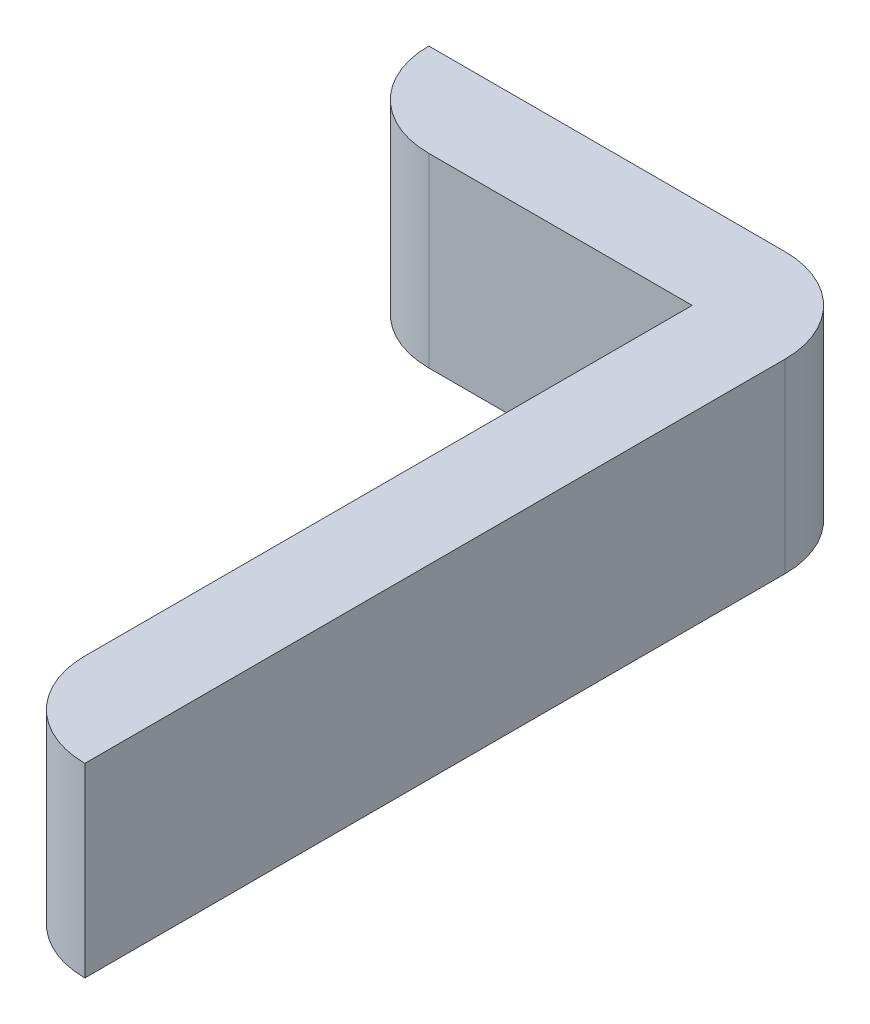
ISO-10303-21;
HEADER;
FILE_DESCRIPTION(('STEP AP214'),'2;1');
FILE_NAME('part.step','',(''),(''),'','','');
FILE_SCHEMA(('AUTOMOTIVE_DESIGN { 1 0 10303 214 1 1 1 1 }'));
ENDSEC;
DATA;
#1=APPLICATION_CONTEXT('core data for automotive mechanical design processes');
#2=APPLICATION_PROTOCOL_DEFINITION('international standard','automotive_design',2000,#1);
#3=PRODUCT_CONTEXT('',#1,'mechanical');
#4=PRODUCT('Part','Part','',(#3));
#5=PRODUCT_RELATED_PRODUCT_CATEGORY('part','',(#4));
#6=PRODUCT_DEFINITION_FORMATION('','',#4);
#7=PRODUCT_DEFINITION_CONTEXT('part definition',#1,'design');
#8=PRODUCT_DEFINITION('design','',#6,#7);
#9=PRODUCT_DEFINITION_SHAPE('','',#8);
#10=(LENGTH_UNIT() NAMED_UNIT(*) SI_UNIT(.MILLI.,.METRE.));
#11=(NAMED_UNIT(*) PLANE_ANGLE_UNIT() SI_UNIT($,.RADIAN.));
#12=(NAMED_UNIT(*) SI_UNIT($,.STERADIAN.) SOLID_ANGLE_UNIT());
#13=UNCERTAINTY_MEASURE_WITH_UNIT(LENGTH_MEASURE(1.E-05),#10,'distance_accuracy_value','');
#14=(GEOMETRIC_REPRESENTATION_CONTEXT(3) GLOBAL_UNCERTAINTY_ASSIGNED_CONTEXT((#13)) GLOBAL_UNIT_ASSIGNED_CONTEXT((#10,
#11,#12)) REPRESENTATION_CONTEXT('',''));
#15=CARTESIAN_POINT('',(0.,0.,0.));
#16=DIRECTION('',(0.,0.,1.));
#17=DIRECTION('',(1.,0.,0.));
#18=AXIS2_PLACEMENT_3D('',#15,#16,#17);
#19=CARTESIAN_POINT('',(4.8,-1.45,0.));
#20=DIRECTION('',(0.,0.,1.));
#21=DIRECTION('',(1.,0.,0.));
#22=AXIS2_PLACEMENT_3D('',#19,#20,#21);
#23=PLANE('',#22);
#24=DIRECTION('',(0.,-1.,0.));
#25=VECTOR('',#24,1.);
#26=CARTESIAN_POINT('',(4.225,-1.45,0.));
#27=LINE('',#26,#25);
#28=CARTESIAN_POINT('',(4.225,-1.15,0.));
#29=VERTEX_POINT('',#28);
#30=CARTESIAN_POINT('',(4.225,-1.45,0.));
#31=VERTEX_POINT('',#30);
#32=EDGE_CURVE('E86',#29,#31,#27,.T.);
#33=ORIENTED_EDGE('',*,*,#32,.F.);
#34=DIRECTION('',(1.,0.,0.));
#35=VECTOR('',#34,1.);
#36=CARTESIAN_POINT('',(4.225,-1.15,0.));
#37=LINE('',#36,#35);
#38=CARTESIAN_POINT('',(4.8,-1.15,0.));
#39=VERTEX_POINT('',#38);
#40=EDGE_CURVE('E89',#29,#39,#37,.T.);
#41=ORIENTED_EDGE('',*,*,#40,.T.);
#42=DIRECTION('',(0.,-1.,0.));
#43=VECTOR('',#42,1.);
#44=CARTESIAN_POINT('',(4.8,-1.45,0.));
#45=LINE('',#44,#43);
#46=CARTESIAN_POINT('',(4.8,-1.45,0.));
#47=VERTEX_POINT('',#46);
#48=EDGE_CURVE('E64',#47,#39,#45,.F.);
#49=ORIENTED_EDGE('',*,*,#48,.F.);
#50=DIRECTION('',(1.,0.,0.));
#51=VECTOR('',#50,1.);
#52=CARTESIAN_POINT('',(4.225,-1.45,0.));
#53=LINE('',#52,#51);
#54=EDGE_CURVE('E112',#31,#47,#53,.T.);
#55=ORIENTED_EDGE('',*,*,#54,.F.);
#56=EDGE_LOOP('',(#33,#41,#49,#55));
#57=FACE_BOUND('',#56,.T.);
#58=ADVANCED_FACE('F17',(#57),#23,.F.);
#59=CARTESIAN_POINT('',(4.8,-1.45,0.15));
#60=DIRECTION('',(0.,-1.,0.));
#61=DIRECTION('',(0.,0.,-1.));
#62=AXIS2_PLACEMENT_3D('',#59,#60,#61);
#63=CYLINDRICAL_SURFACE('',#62,0.15);
#64=CARTESIAN_POINT('',(4.8,-1.15,0.15));
#65=DIRECTION('',(0.,-1.,0.));
#66=DIRECTION('',(0.,0.,-1.));
#67=AXIS2_PLACEMENT_3D('',#64,#65,#66);
#68=CIRCLE('',#67,0.15);
#69=CARTESIAN_POINT('',(4.95,-1.15,0.15));
#70=VERTEX_POINT('',#69);
#71=EDGE_CURVE('E20',#39,#70,#68,.T.);
#72=ORIENTED_EDGE('',*,*,#71,.T.);
#73=DIRECTION('',(0.,1.,0.));
#74=VECTOR('',#73,1.);
#75=CARTESIAN_POINT('',(4.95,-1.45,0.15));
#76=LINE('',#75,#74);
#77=CARTESIAN_POINT('',(4.95,-1.45,0.15));
#78=VERTEX_POINT('',#77);
#79=EDGE_CURVE('E82',#70,#78,#76,.F.);
#80=ORIENTED_EDGE('',*,*,#79,.T.);
#81=CARTESIAN_POINT('',(4.8,-1.45,0.15));
#82=DIRECTION('',(0.,-1.,0.));
#83=DIRECTION('',(0.,0.,-1.));
#84=AXIS2_PLACEMENT_3D('',#81,#82,#83);
#85=CIRCLE('',#84,0.15);
#86=EDGE_CURVE('E110',#47,#78,#85,.T.);
#87=ORIENTED_EDGE('',*,*,#86,.F.);
#88=ORIENTED_EDGE('',*,*,#48,.T.);
#89=EDGE_LOOP('',(#72,#80,#87,#88));
#90=FACE_BOUND('',#89,.T.);
#91=ADVANCED_FACE('F88',(#90),#63,.T.);
#92=CARTESIAN_POINT('',(4.95,-1.45,1.28));
#93=DIRECTION('',(-1.,0.,0.));
#94=DIRECTION('',(0.,0.,1.));
#95=AXIS2_PLACEMENT_3D('',#92,#93,#94);
#96=PLANE('',#95);
#97=DIRECTION('',(0.,0.,-1.));
#98=VECTOR('',#97,1.);
#99=CARTESIAN_POINT('',(4.95,-1.45,0.));
#100=LINE('',#99,#98);
#101=CARTESIAN_POINT('',(4.95,-1.45,1.28));
#102=VERTEX_POINT('',#101);
#103=EDGE_CURVE('E84',#78,#102,#100,.F.);
#104=ORIENTED_EDGE('',*,*,#103,.F.);
#105=ORIENTED_EDGE('',*,*,#79,.F.);
#106=DIRECTION('',(0.,0.,-1.));
#107=VECTOR('',#106,1.);
#108=CARTESIAN_POINT('',(4.95,-1.15,0.));
#109=LINE('',#108,#107);
#110=CARTESIAN_POINT('',(4.95,-1.15,1.28));
#111=VERTEX_POINT('',#110);
#112=EDGE_CURVE('E70',#70,#111,#109,.F.);
#113=ORIENTED_EDGE('',*,*,#112,.T.);
#114=DIRECTION('',(0.,-1.,0.));
#115=VECTOR('',#114,1.);
#116=CARTESIAN_POINT('',(4.95,-1.45,1.28));
#117=LINE('',#116,#115);
#118=EDGE_CURVE('E100',#102,#111,#117,.F.);
#119=ORIENTED_EDGE('',*,*,#118,.F.);
#120=EDGE_LOOP('',(#104,#105,#113,#119));
#121=FACE_BOUND('',#120,.T.);
#122=ADVANCED_FACE('F83',(#121),#96,.F.);
#123=CARTESIAN_POINT('',(4.375,-1.45,0.));
#124=DIRECTION('',(0.,-1.,0.));
#125=DIRECTION('',(0.,0.,-1.));
#126=AXIS2_PLACEMENT_3D('',#123,#124,#125);
#127=CYLINDRICAL_SURFACE('',#126,0.15);
#128=CARTESIAN_POINT('',(4.375,-1.15,0.));
#129=DIRECTION('',(0.,-1.,0.));
#130=DIRECTION('',(0.,0.,-1.));
#131=AXIS2_PLACEMENT_3D('',#128,#129,#130);
#132=CIRCLE('',#131,0.15);
#133=CARTESIAN_POINT('',(4.375,-1.15,0.15));
#134=VERTEX_POINT('',#133);
#135=EDGE_CURVE('E101',#134,#29,#132,.T.);
#136=ORIENTED_EDGE('',*,*,#135,.T.);
#137=ORIENTED_EDGE('',*,*,#32,.T.);
#138=CARTESIAN_POINT('',(4.375,-1.45,0.));
#139=DIRECTION('',(0.,-1.,0.));
#140=DIRECTION('',(0.,0.,-1.));
#141=AXIS2_PLACEMENT_3D('',#138,#139,#140);
#142=CIRCLE('',#141,0.15);
#143=CARTESIAN_POINT('',(4.375,-1.45,0.15));
#144=VERTEX_POINT('',#143);
#145=EDGE_CURVE('E104',#144,#31,#142,.T.);
#146=ORIENTED_EDGE('',*,*,#145,.F.);
#147=DIRECTION('',(0.,1.,0.));
#148=VECTOR('',#147,1.);
#149=CARTESIAN_POINT('',(4.375,-1.45,0.15));
#150=LINE('',#149,#148);
#151=EDGE_CURVE('E90',#144,#134,#150,.T.);
#152=ORIENTED_EDGE('',*,*,#151,.T.);
#153=EDGE_LOOP('',(#136,#137,#146,#152));
#154=FACE_BOUND('',#153,.T.);
#155=ADVANCED_FACE('F149',(#154),#127,.T.);
#156=CARTESIAN_POINT('',(4.375,-1.45,0.15));
#157=DIRECTION('',(0.,0.,-1.));
#158=DIRECTION('',(-1.,0.,0.));
#159=AXIS2_PLACEMENT_3D('',#156,#157,#158);
#160=PLANE('',#159);
#161=DIRECTION('',(0.,1.,0.));
#162=VECTOR('',#161,1.);
#163=CARTESIAN_POINT('',(4.8,-1.45,0.15));
#164=LINE('',#163,#162);
#165=CARTESIAN_POINT('',(4.8,-1.45,0.15));
#166=VERTEX_POINT('',#165);
#167=CARTESIAN_POINT('',(4.8,-1.15,0.15));
#168=VERTEX_POINT('',#167);
#169=EDGE_CURVE('E107',#166,#168,#164,.T.);
#170=ORIENTED_EDGE('',*,*,#169,.T.);
#171=DIRECTION('',(1.,0.,0.));
#172=VECTOR('',#171,1.);
#173=CARTESIAN_POINT('',(4.225,-1.15,0.15));
#174=LINE('',#173,#172);
#175=EDGE_CURVE('E79',#168,#134,#174,.F.);
#176=ORIENTED_EDGE('',*,*,#175,.T.);
#177=ORIENTED_EDGE('',*,*,#151,.F.);
#178=DIRECTION('',(1.,0.,0.));
#179=VECTOR('',#178,1.);
#180=CARTESIAN_POINT('',(4.225,-1.45,0.15));
#181=LINE('',#180,#179);
#182=EDGE_CURVE('E108',#166,#144,#181,.F.);
#183=ORIENTED_EDGE('',*,*,#182,.F.);
#184=EDGE_LOOP('',(#170,#176,#177,#183));
#185=FACE_BOUND('',#184,.T.);
#186=ADVANCED_FACE('F159',(#185),#160,.F.);
#187=CARTESIAN_POINT('',(4.225,-1.15,0.));
#188=DIRECTION('',(0.,-1.,0.));
#189=DIRECTION('',(0.,0.,-1.));
#190=AXIS2_PLACEMENT_3D('',#187,#188,#189);
#191=PLANE('',#190);
#192=ORIENTED_EDGE('',*,*,#175,.F.);
#193=DIRECTION('',(0.,0.,-1.));
#194=VECTOR('',#193,1.);
#195=CARTESIAN_POINT('',(4.8,-1.15,0.15));
#196=LINE('',#195,#194);
#197=CARTESIAN_POINT('',(4.8,-1.15,1.13));
#198=VERTEX_POINT('',#197);
#199=EDGE_CURVE('E126',#168,#198,#196,.F.);
#200=ORIENTED_EDGE('',*,*,#199,.T.);
#201=CARTESIAN_POINT('',(4.95,-1.15,1.13));
#202=DIRECTION('',(0.,-1.,0.));
#203=DIRECTION('',(0.,0.,-1.));
#204=AXIS2_PLACEMENT_3D('',#201,#202,#203);
#205=CIRCLE('',#204,0.15);
#206=EDGE_CURVE('E76',#111,#198,#205,.T.);
#207=ORIENTED_EDGE('',*,*,#206,.F.);
#208=ORIENTED_EDGE('',*,*,#112,.F.);
#209=ORIENTED_EDGE('',*,*,#71,.F.);
#210=ORIENTED_EDGE('',*,*,#40,.F.);
#211=ORIENTED_EDGE('',*,*,#135,.F.);
#212=EDGE_LOOP('',(#192,#200,#207,#208,#209,#210,#211));
#213=FACE_BOUND('',#212,.T.);
#214=ADVANCED_FACE('F73',(#213),#191,.F.);
#215=CARTESIAN_POINT('',(4.95,-1.45,1.13));
#216=DIRECTION('',(0.,-1.,0.));
#217=DIRECTION('',(0.,0.,-1.));
#218=AXIS2_PLACEMENT_3D('',#215,#216,#217);
#219=CYLINDRICAL_SURFACE('',#218,0.15);
#220=ORIENTED_EDGE('',*,*,#206,.T.);
#221=DIRECTION('',(0.,1.,0.));
#222=VECTOR('',#221,1.);
#223=CARTESIAN_POINT('',(4.8,-1.45,1.13));
#224=LINE('',#223,#222);
#225=CARTESIAN_POINT('',(4.8,-1.45,1.13));
#226=VERTEX_POINT('',#225);
#227=EDGE_CURVE('E26',#198,#226,#224,.F.);
#228=ORIENTED_EDGE('',*,*,#227,.T.);
#229=CARTESIAN_POINT('',(4.95,-1.45,1.13));
#230=DIRECTION('',(0.,-1.,0.));
#231=DIRECTION('',(0.,0.,-1.));
#232=AXIS2_PLACEMENT_3D('',#229,#230,#231);
#233=CIRCLE('',#232,0.15);
#234=EDGE_CURVE('E34',#102,#226,#233,.T.);
#235=ORIENTED_EDGE('',*,*,#234,.F.);
#236=ORIENTED_EDGE('',*,*,#118,.T.);
#237=EDGE_LOOP('',(#220,#228,#235,#236));
#238=FACE_BOUND('',#237,.T.);
#239=ADVANCED_FACE('F151',(#238),#219,.T.);
#240=CARTESIAN_POINT('',(4.225,-1.45,0.));
#241=DIRECTION('',(0.,-1.,0.));
#242=DIRECTION('',(0.,0.,-1.));
#243=AXIS2_PLACEMENT_3D('',#240,#241,#242);
#244=PLANE('',#243);
#245=ORIENTED_EDGE('',*,*,#182,.T.);
#246=ORIENTED_EDGE('',*,*,#145,.T.);
#247=ORIENTED_EDGE('',*,*,#54,.T.);
#248=ORIENTED_EDGE('',*,*,#86,.T.);
#249=ORIENTED_EDGE('',*,*,#103,.T.);
#250=ORIENTED_EDGE('',*,*,#234,.T.);
#251=DIRECTION('',(0.,0.,-1.));
#252=VECTOR('',#251,1.);
#253=CARTESIAN_POINT('',(4.8,-1.45,0.15));
#254=LINE('',#253,#252);
#255=EDGE_CURVE('E11',#226,#166,#254,.T.);
#256=ORIENTED_EDGE('',*,*,#255,.T.);
#257=EDGE_LOOP('',(#245,#246,#247,#248,#249,#250,#256));
#258=FACE_BOUND('',#257,.T.);
#259=ADVANCED_FACE('F145',(#258),#244,.T.);
#260=CARTESIAN_POINT('',(4.8,-1.45,0.15));
#261=DIRECTION('',(1.,0.,0.));
#262=DIRECTION('',(0.,0.,-1.));
#263=AXIS2_PLACEMENT_3D('',#260,#261,#262);
#264=PLANE('',#263);
#265=ORIENTED_EDGE('',*,*,#227,.F.);
#266=ORIENTED_EDGE('',*,*,#199,.F.);
#267=ORIENTED_EDGE('',*,*,#169,.F.);
#268=ORIENTED_EDGE('',*,*,#255,.F.);
#269=EDGE_LOOP('',(#265,#266,#267,#268));
#270=FACE_BOUND('',#269,.T.);
#271=ADVANCED_FACE('F155',(#270),#264,.F.);
#272=CLOSED_SHELL('',(#58,#91,#122,#155,#186,#214,#239,#259,#271));
#273=MANIFOLD_SOLID_BREP('B1',#272);
#274=ADVANCED_BREP_SHAPE_REPRESENTATION('',(#18,#273),#14);
#275=SHAPE_DEFINITION_REPRESENTATION(#9,#274);
ENDSEC;
END-ISO-10303-21;
